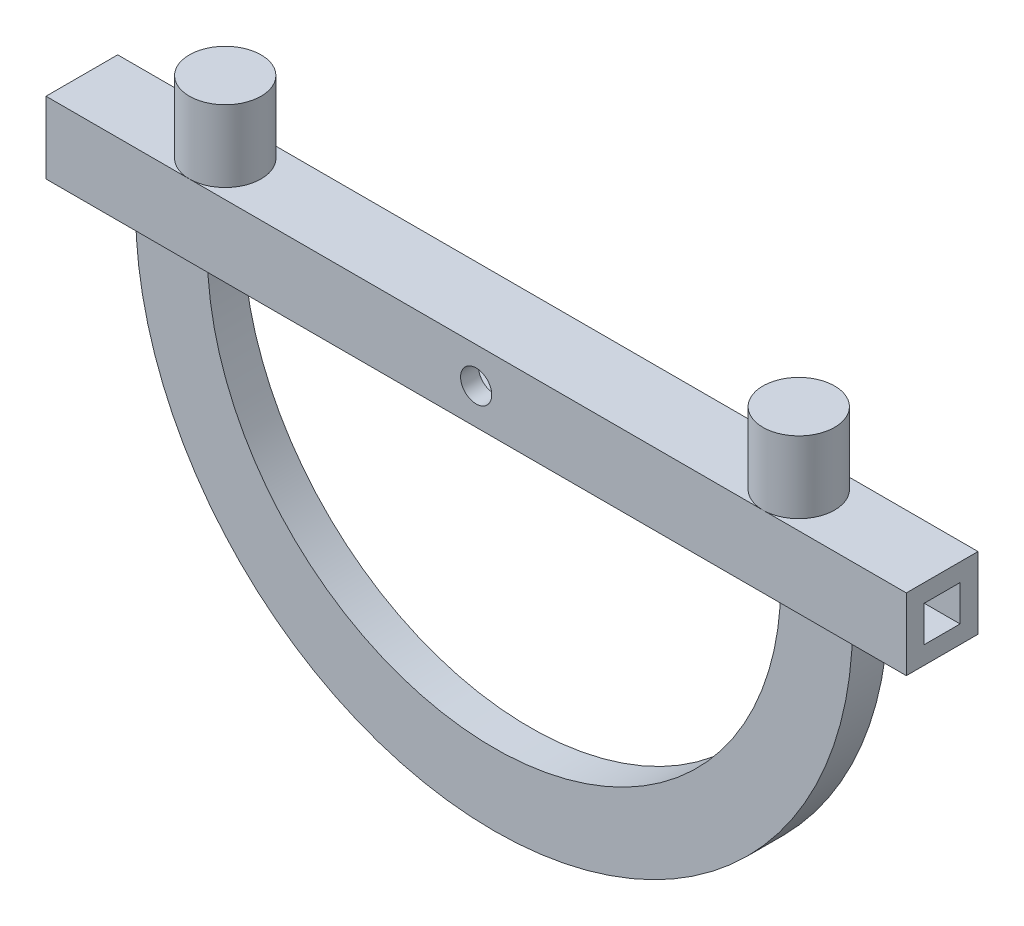
ISO-10303-21;
HEADER;
FILE_DESCRIPTION(('STEP AP214'),'2;1');
FILE_NAME('part.step','',(''),(''),'','','');
FILE_SCHEMA(('AUTOMOTIVE_DESIGN { 1 0 10303 214 1 1 1 1 }'));
ENDSEC;
DATA;
#1=APPLICATION_CONTEXT('core data for automotive mechanical design processes');
#2=APPLICATION_PROTOCOL_DEFINITION('international standard','automotive_design',2000,#1);
#3=PRODUCT_CONTEXT('',#1,'mechanical');
#4=PRODUCT('Part','Part','',(#3));
#5=PRODUCT_RELATED_PRODUCT_CATEGORY('part','',(#4));
#6=PRODUCT_DEFINITION_FORMATION('','',#4);
#7=PRODUCT_DEFINITION_CONTEXT('part definition',#1,'design');
#8=PRODUCT_DEFINITION('design','',#6,#7);
#9=PRODUCT_DEFINITION_SHAPE('','',#8);
#10=(LENGTH_UNIT() NAMED_UNIT(*) SI_UNIT(.MILLI.,.METRE.));
#11=(NAMED_UNIT(*) PLANE_ANGLE_UNIT() SI_UNIT($,.RADIAN.));
#12=(NAMED_UNIT(*) SI_UNIT($,.STERADIAN.) SOLID_ANGLE_UNIT());
#13=UNCERTAINTY_MEASURE_WITH_UNIT(LENGTH_MEASURE(1.E-05),#10,'distance_accuracy_value','');
#14=(GEOMETRIC_REPRESENTATION_CONTEXT(3) GLOBAL_UNCERTAINTY_ASSIGNED_CONTEXT((#13)) GLOBAL_UNIT_ASSIGNED_CONTEXT((#10,
#11,#12)) REPRESENTATION_CONTEXT('',''));
#15=CARTESIAN_POINT('',(0.,0.,0.));
#16=DIRECTION('',(0.,0.,1.));
#17=DIRECTION('',(1.,0.,0.));
#18=AXIS2_PLACEMENT_3D('',#15,#16,#17);
#19=CARTESIAN_POINT('',(-120.,20.0000000000004,10.));
#20=DIRECTION('',(0.,1.,0.));
#21=DIRECTION('',(0.,0.,1.));
#22=AXIS2_PLACEMENT_3D('',#19,#20,#21);
#23=PLANE('',#22);
#24=DIRECTION('',(1.,0.,0.));
#25=VECTOR('',#24,1.);
#26=CARTESIAN_POINT('',(-120.,20.0000000000004,10.));
#27=LINE('',#26,#25);
#28=CARTESIAN_POINT('',(-80.,20.0000000000004,9.99999999999999));
#29=VERTEX_POINT('',#28);
#30=CARTESIAN_POINT('',(80.,20.0000000000004,10.));
#31=VERTEX_POINT('',#30);
#32=EDGE_CURVE('E146',#29,#31,#27,.T.);
#33=ORIENTED_EDGE('',*,*,#32,.T.);
#34=CARTESIAN_POINT('',(80.,20.0000000000004,0.));
#35=DIRECTION('',(0.,1.,0.));
#36=DIRECTION('',(0.,0.,1.));
#37=AXIS2_PLACEMENT_3D('',#34,#35,#36);
#38=CIRCLE('',#37,9.99999999999999);
#39=CARTESIAN_POINT('',(80.,20.0000000000004,-10.));
#40=VERTEX_POINT('',#39);
#41=EDGE_CURVE('E50',#40,#31,#38,.T.);
#42=ORIENTED_EDGE('',*,*,#41,.F.);
#43=DIRECTION('',(1.,0.,0.));
#44=VECTOR('',#43,1.);
#45=CARTESIAN_POINT('',(-120.,20.0000000000004,-10.));
#46=LINE('',#45,#44);
#47=CARTESIAN_POINT('',(-80.,20.0000000000004,-10.));
#48=VERTEX_POINT('',#47);
#49=EDGE_CURVE('E143',#48,#40,#46,.T.);
#50=ORIENTED_EDGE('',*,*,#49,.F.);
#51=CARTESIAN_POINT('',(-80.,20.0000000000004,0.));
#52=DIRECTION('',(0.,1.,0.));
#53=DIRECTION('',(0.,0.,1.));
#54=AXIS2_PLACEMENT_3D('',#51,#52,#53);
#55=CIRCLE('',#54,9.99999999999999);
#56=EDGE_CURVE('E44',#29,#48,#55,.T.);
#57=ORIENTED_EDGE('',*,*,#56,.F.);
#58=EDGE_LOOP('',(#33,#42,#50,#57));
#59=FACE_BOUND('',#58,.T.);
#60=ADVANCED_FACE('F33',(#59),#23,.T.);
#61=CARTESIAN_POINT('',(120.,20.0000000000004,-10.));
#62=VERTEX_POINT('',#61);
#63=EDGE_CURVE('E148',#40,#62,#46,.T.);
#64=ORIENTED_EDGE('',*,*,#63,.F.);
#65=EDGE_CURVE('E132',#31,#40,#38,.T.);
#66=ORIENTED_EDGE('',*,*,#65,.F.);
#67=CARTESIAN_POINT('',(120.,20.0000000000004,10.));
#68=VERTEX_POINT('',#67);
#69=EDGE_CURVE('E161',#31,#68,#27,.T.);
#70=ORIENTED_EDGE('',*,*,#69,.T.);
#71=DIRECTION('',(0.,0.,1.));
#72=VECTOR('',#71,1.);
#73=CARTESIAN_POINT('',(120.,20.0000000000004,10.));
#74=LINE('',#73,#72);
#75=EDGE_CURVE('E151',#62,#68,#74,.T.);
#76=ORIENTED_EDGE('',*,*,#75,.F.);
#77=EDGE_LOOP('',(#64,#66,#70,#76));
#78=FACE_BOUND('',#77,.T.);
#79=ADVANCED_FACE('F149',(#78),#23,.T.);
#80=CARTESIAN_POINT('',(0.,0.,-5.));
#81=DIRECTION('',(0.,0.,1.));
#82=DIRECTION('',(1.,0.,0.));
#83=AXIS2_PLACEMENT_3D('',#80,#81,#82);
#84=CYLINDRICAL_SURFACE('',#83,100.);
#85=DIRECTION('',(0.,0.,1.));
#86=VECTOR('',#85,1.);
#87=CARTESIAN_POINT('',(100.,3.85887537858734E-13,-5.));
#88=LINE('',#87,#86);
#89=CARTESIAN_POINT('',(100.,3.85692806310763E-13,-5.));
#90=VERTEX_POINT('',#89);
#91=CARTESIAN_POINT('',(100.,0.,5.));
#92=VERTEX_POINT('',#91);
#93=EDGE_CURVE('E189',#90,#92,#88,.T.);
#94=ORIENTED_EDGE('',*,*,#93,.T.);
#95=CARTESIAN_POINT('',(0.,0.,5.));
#96=DIRECTION('',(0.,0.,1.));
#97=DIRECTION('',(1.,0.,0.));
#98=AXIS2_PLACEMENT_3D('',#95,#96,#97);
#99=CIRCLE('',#98,100.);
#100=CARTESIAN_POINT('',(-100.,2.48083823922827E-13,5.));
#101=VERTEX_POINT('',#100);
#102=EDGE_CURVE('E166',#101,#92,#99,.T.);
#103=ORIENTED_EDGE('',*,*,#102,.F.);
#104=DIRECTION('',(0.,0.,1.));
#105=VECTOR('',#104,1.);
#106=CARTESIAN_POINT('',(-100.,2.48083823922827E-13,-5.));
#107=LINE('',#106,#105);
#108=CARTESIAN_POINT('',(-100.,3.85692806310763E-13,-5.));
#109=VERTEX_POINT('',#108);
#110=EDGE_CURVE('E42',#109,#101,#107,.T.);
#111=ORIENTED_EDGE('',*,*,#110,.F.);
#112=CARTESIAN_POINT('',(0.,0.,-5.));
#113=DIRECTION('',(0.,0.,1.));
#114=DIRECTION('',(1.,0.,0.));
#115=AXIS2_PLACEMENT_3D('',#112,#113,#114);
#116=CIRCLE('',#115,100.);
#117=EDGE_CURVE('E179',#109,#90,#116,.T.);
#118=ORIENTED_EDGE('',*,*,#117,.T.);
#119=EDGE_LOOP('',(#94,#103,#111,#118));
#120=FACE_BOUND('',#119,.T.);
#121=ADVANCED_FACE('F35',(#120),#84,.T.);
#122=CARTESIAN_POINT('',(0.,0.,-5.));
#123=DIRECTION('',(0.,0.,1.));
#124=DIRECTION('',(1.,0.,0.));
#125=AXIS2_PLACEMENT_3D('',#122,#123,#124);
#126=CYLINDRICAL_SURFACE('',#125,80.);
#127=DIRECTION('',(0.,0.,1.));
#128=VECTOR('',#127,1.);
#129=CARTESIAN_POINT('',(-80.,1.98467059138262E-13,-5.));
#130=LINE('',#129,#128);
#131=CARTESIAN_POINT('',(-80.,3.85692806310763E-13,-5.));
#132=VERTEX_POINT('',#131);
#133=CARTESIAN_POINT('',(-80.,0.,5.));
#134=VERTEX_POINT('',#133);
#135=EDGE_CURVE('E191',#132,#134,#130,.T.);
#136=ORIENTED_EDGE('',*,*,#135,.T.);
#137=CARTESIAN_POINT('',(0.,0.,5.));
#138=DIRECTION('',(0.,0.,-1.));
#139=DIRECTION('',(1.,0.,0.));
#140=AXIS2_PLACEMENT_3D('',#137,#138,#139);
#141=CIRCLE('',#140,80.);
#142=CARTESIAN_POINT('',(80.,0.,5.));
#143=VERTEX_POINT('',#142);
#144=EDGE_CURVE('E173',#143,#134,#141,.T.);
#145=ORIENTED_EDGE('',*,*,#144,.F.);
#146=DIRECTION('',(0.,0.,1.));
#147=VECTOR('',#146,1.);
#148=CARTESIAN_POINT('',(80.,0.,-5.));
#149=LINE('',#148,#147);
#150=CARTESIAN_POINT('',(80.,3.85692806310763E-13,-5.));
#151=VERTEX_POINT('',#150);
#152=EDGE_CURVE('E194',#151,#143,#149,.T.);
#153=ORIENTED_EDGE('',*,*,#152,.F.);
#154=CARTESIAN_POINT('',(0.,0.,-5.));
#155=DIRECTION('',(0.,0.,-1.));
#156=DIRECTION('',(1.,0.,0.));
#157=AXIS2_PLACEMENT_3D('',#154,#155,#156);
#158=CIRCLE('',#157,80.);
#159=EDGE_CURVE('E184',#151,#132,#158,.T.);
#160=ORIENTED_EDGE('',*,*,#159,.T.);
#161=EDGE_LOOP('',(#136,#145,#153,#160));
#162=FACE_BOUND('',#161,.T.);
#163=ADVANCED_FACE('F208',(#162),#126,.F.);
#164=CARTESIAN_POINT('',(0.,0.,-5.));
#165=DIRECTION('',(0.,0.,1.));
#166=DIRECTION('',(1.,0.,0.));
#167=AXIS2_PLACEMENT_3D('',#164,#165,#166);
#168=PLANE('',#167);
#169=ORIENTED_EDGE('',*,*,#117,.F.);
#170=DIRECTION('',(-1.,0.,0.));
#171=VECTOR('',#170,1.);
#172=CARTESIAN_POINT('',(-100.,2.48083823922827E-13,-5.));
#173=LINE('',#172,#171);
#174=EDGE_CURVE('E187',#132,#109,#173,.T.);
#175=ORIENTED_EDGE('',*,*,#174,.F.);
#176=ORIENTED_EDGE('',*,*,#159,.F.);
#177=DIRECTION('',(-1.,0.,0.));
#178=VECTOR('',#177,1.);
#179=CARTESIAN_POINT('',(80.,3.08710030286987E-13,-5.));
#180=LINE('',#179,#178);
#181=EDGE_CURVE('E182',#90,#151,#180,.T.);
#182=ORIENTED_EDGE('',*,*,#181,.F.);
#183=EDGE_LOOP('',(#169,#175,#176,#182));
#184=FACE_BOUND('',#183,.T.);
#185=ADVANCED_FACE('F213',(#184),#168,.F.);
#186=CARTESIAN_POINT('',(0.,0.,5.));
#187=DIRECTION('',(0.,0.,1.));
#188=DIRECTION('',(1.,0.,0.));
#189=AXIS2_PLACEMENT_3D('',#186,#187,#188);
#190=PLANE('',#189);
#191=ORIENTED_EDGE('',*,*,#102,.T.);
#192=DIRECTION('',(-1.,0.,0.));
#193=VECTOR('',#192,1.);
#194=CARTESIAN_POINT('',(80.,3.08710030286987E-13,5.));
#195=LINE('',#194,#193);
#196=EDGE_CURVE('E169',#92,#143,#195,.T.);
#197=ORIENTED_EDGE('',*,*,#196,.T.);
#198=ORIENTED_EDGE('',*,*,#144,.T.);
#199=DIRECTION('',(-1.,0.,0.));
#200=VECTOR('',#199,1.);
#201=CARTESIAN_POINT('',(-100.,2.48083823922827E-13,5.));
#202=LINE('',#201,#200);
#203=EDGE_CURVE('E176',#134,#101,#202,.T.);
#204=ORIENTED_EDGE('',*,*,#203,.T.);
#205=EDGE_LOOP('',(#191,#197,#198,#204));
#206=FACE_BOUND('',#205,.T.);
#207=ADVANCED_FACE('F203',(#206),#190,.T.);
#208=CARTESIAN_POINT('',(-120.,3.85108611666851E-13,10.));
#209=DIRECTION('',(0.,-1.,0.));
#210=DIRECTION('',(0.,0.,-1.));
#211=AXIS2_PLACEMENT_3D('',#208,#209,#210);
#212=PLANE('',#211);
#213=ORIENTED_EDGE('',*,*,#181,.T.);
#214=ORIENTED_EDGE('',*,*,#152,.T.);
#215=ORIENTED_EDGE('',*,*,#196,.F.);
#216=ORIENTED_EDGE('',*,*,#93,.F.);
#217=EDGE_LOOP('',(#213,#214,#215,#216));
#218=FACE_BOUND('',#217,.T.);
#219=DIRECTION('',(1.,0.,0.));
#220=VECTOR('',#219,1.);
#221=CARTESIAN_POINT('',(-120.,3.85887537858734E-13,-10.));
#222=LINE('',#221,#220);
#223=CARTESIAN_POINT('',(-120.,3.85887537858734E-13,-10.));
#224=VERTEX_POINT('',#223);
#225=CARTESIAN_POINT('',(120.,3.85887537858734E-13,-10.));
#226=VERTEX_POINT('',#225);
#227=EDGE_CURVE('E170',#224,#226,#222,.T.);
#228=ORIENTED_EDGE('',*,*,#227,.T.);
#229=DIRECTION('',(0.,0.,-1.));
#230=VECTOR('',#229,1.);
#231=CARTESIAN_POINT('',(120.,3.85108611666851E-13,10.));
#232=LINE('',#231,#230);
#233=CARTESIAN_POINT('',(120.,3.85108611666851E-13,10.));
#234=VERTEX_POINT('',#233);
#235=EDGE_CURVE('E220',#234,#226,#232,.T.);
#236=ORIENTED_EDGE('',*,*,#235,.F.);
#237=DIRECTION('',(1.,0.,0.));
#238=VECTOR('',#237,1.);
#239=CARTESIAN_POINT('',(-120.,3.85108611666851E-13,10.));
#240=LINE('',#239,#238);
#241=CARTESIAN_POINT('',(-120.,3.85108611666851E-13,10.));
#242=VERTEX_POINT('',#241);
#243=EDGE_CURVE('E223',#242,#234,#240,.T.);
#244=ORIENTED_EDGE('',*,*,#243,.F.);
#245=DIRECTION('',(0.,0.,-1.));
#246=VECTOR('',#245,1.);
#247=CARTESIAN_POINT('',(-120.,3.85108611666851E-13,10.));
#248=LINE('',#247,#246);
#249=EDGE_CURVE('E155',#242,#224,#248,.T.);
#250=ORIENTED_EDGE('',*,*,#249,.T.);
#251=EDGE_LOOP('',(#228,#236,#244,#250));
#252=FACE_BOUND('',#251,.T.);
#253=ORIENTED_EDGE('',*,*,#174,.T.);
#254=ORIENTED_EDGE('',*,*,#110,.T.);
#255=ORIENTED_EDGE('',*,*,#203,.F.);
#256=ORIENTED_EDGE('',*,*,#135,.F.);
#257=EDGE_LOOP('',(#253,#254,#255,#256));
#258=FACE_BOUND('',#257,.T.);
#259=ADVANCED_FACE('F206',(#218,#252,#258),#212,.T.);
#260=CARTESIAN_POINT('',(-120.,20.0000000000004,-10.));
#261=DIRECTION('',(0.,0.,-1.));
#262=DIRECTION('',(0.,1.,0.));
#263=AXIS2_PLACEMENT_3D('',#260,#261,#262);
#264=PLANE('',#263);
#265=CARTESIAN_POINT('',(0.,10.0000000000004,-10.));
#266=DIRECTION('',(0.,0.,-1.));
#267=DIRECTION('',(0.,1.,0.));
#268=AXIS2_PLACEMENT_3D('',#265,#266,#267);
#269=CIRCLE('',#268,4.3511177416387);
#270=CARTESIAN_POINT('',(0.,14.3511177416391,-10.));
#271=VERTEX_POINT('',#270);
#272=EDGE_CURVE('E404',#271,#271,#269,.T.);
#273=ORIENTED_EDGE('',*,*,#272,.F.);
#274=EDGE_LOOP('',(#273));
#275=FACE_BOUND('',#274,.T.);
#276=CARTESIAN_POINT('',(-120.,20.0000000000004,-10.));
#277=VERTEX_POINT('',#276);
#278=EDGE_CURVE('E157',#277,#48,#46,.T.);
#279=ORIENTED_EDGE('',*,*,#278,.T.);
#280=ORIENTED_EDGE('',*,*,#49,.T.);
#281=ORIENTED_EDGE('',*,*,#63,.T.);
#282=DIRECTION('',(0.,1.,0.));
#283=VECTOR('',#282,1.);
#284=CARTESIAN_POINT('',(120.,20.0000000000004,-10.));
#285=LINE('',#284,#283);
#286=EDGE_CURVE('E229',#226,#62,#285,.T.);
#287=ORIENTED_EDGE('',*,*,#286,.F.);
#288=ORIENTED_EDGE('',*,*,#227,.F.);
#289=DIRECTION('',(0.,1.,0.));
#290=VECTOR('',#289,1.);
#291=CARTESIAN_POINT('',(-120.,20.0000000000004,-10.));
#292=LINE('',#291,#290);
#293=EDGE_CURVE('E257',#224,#277,#292,.T.);
#294=ORIENTED_EDGE('',*,*,#293,.T.);
#295=EDGE_LOOP('',(#279,#280,#281,#287,#288,#294));
#296=FACE_BOUND('',#295,.T.);
#297=ADVANCED_FACE('F158',(#275,#296),#264,.T.);
#298=CARTESIAN_POINT('',(-120.,20.0000000000004,10.));
#299=DIRECTION('',(0.,0.,1.));
#300=DIRECTION('',(1.,0.,0.));
#301=AXIS2_PLACEMENT_3D('',#298,#299,#300);
#302=PLANE('',#301);
#303=CARTESIAN_POINT('',(0.,10.0000000000004,9.99999999999999));
#304=DIRECTION('',(0.,0.,1.));
#305=DIRECTION('',(1.,0.,0.));
#306=AXIS2_PLACEMENT_3D('',#303,#304,#305);
#307=CIRCLE('',#306,4.3511177416387);
#308=CARTESIAN_POINT('',(4.3511177416387,10.0000000000004,9.99999999999999));
#309=VERTEX_POINT('',#308);
#310=EDGE_CURVE('E413',#309,#309,#307,.T.);
#311=ORIENTED_EDGE('',*,*,#310,.F.);
#312=EDGE_LOOP('',(#311));
#313=FACE_BOUND('',#312,.T.);
#314=ORIENTED_EDGE('',*,*,#243,.T.);
#315=DIRECTION('',(0.,-1.,0.));
#316=VECTOR('',#315,1.);
#317=CARTESIAN_POINT('',(120.,20.0000000000004,10.));
#318=LINE('',#317,#316);
#319=EDGE_CURVE('E231',#68,#234,#318,.T.);
#320=ORIENTED_EDGE('',*,*,#319,.F.);
#321=ORIENTED_EDGE('',*,*,#69,.F.);
#322=ORIENTED_EDGE('',*,*,#32,.F.);
#323=CARTESIAN_POINT('',(-120.,20.0000000000004,10.));
#324=VERTEX_POINT('',#323);
#325=EDGE_CURVE('E164',#324,#29,#27,.T.);
#326=ORIENTED_EDGE('',*,*,#325,.F.);
#327=DIRECTION('',(0.,-1.,0.));
#328=VECTOR('',#327,1.);
#329=CARTESIAN_POINT('',(-120.,20.0000000000004,10.));
#330=LINE('',#329,#328);
#331=EDGE_CURVE('E267',#324,#242,#330,.T.);
#332=ORIENTED_EDGE('',*,*,#331,.T.);
#333=EDGE_LOOP('',(#314,#320,#321,#322,#326,#332));
#334=FACE_BOUND('',#333,.T.);
#335=ADVANCED_FACE('F271',(#313,#334),#302,.T.);
#336=EDGE_CURVE('E11',#48,#29,#55,.T.);
#337=ORIENTED_EDGE('',*,*,#336,.F.);
#338=ORIENTED_EDGE('',*,*,#278,.F.);
#339=DIRECTION('',(0.,0.,1.));
#340=VECTOR('',#339,1.);
#341=CARTESIAN_POINT('',(-120.,20.0000000000004,10.));
#342=LINE('',#341,#340);
#343=EDGE_CURVE('E264',#277,#324,#342,.T.);
#344=ORIENTED_EDGE('',*,*,#343,.T.);
#345=ORIENTED_EDGE('',*,*,#325,.T.);
#346=EDGE_LOOP('',(#337,#338,#344,#345));
#347=FACE_BOUND('',#346,.T.);
#348=ADVANCED_FACE('F273',(#347),#23,.T.);
#349=CARTESIAN_POINT('',(-120.,0.,0.));
#350=DIRECTION('',(1.,0.,0.));
#351=DIRECTION('',(0.,0.,-1.));
#352=AXIS2_PLACEMENT_3D('',#349,#350,#351);
#353=PLANE('',#352);
#354=DIRECTION('',(0.,0.,-1.));
#355=VECTOR('',#354,1.);
#356=CARTESIAN_POINT('',(-120.,5.00000000000039,4.99999999999999));
#357=LINE('',#356,#355);
#358=CARTESIAN_POINT('',(-120.,5.00000000000039,4.99999999999999));
#359=VERTEX_POINT('',#358);
#360=CARTESIAN_POINT('',(-120.,5.00000000000039,-5.00000000000001));
#361=VERTEX_POINT('',#360);
#362=EDGE_CURVE('E251',#359,#361,#357,.T.);
#363=ORIENTED_EDGE('',*,*,#362,.T.);
#364=DIRECTION('',(0.,1.,0.));
#365=VECTOR('',#364,1.);
#366=CARTESIAN_POINT('',(-120.,15.0000000000004,-5.));
#367=LINE('',#366,#365);
#368=CARTESIAN_POINT('',(-120.,15.0000000000004,-5.));
#369=VERTEX_POINT('',#368);
#370=EDGE_CURVE('E232',#361,#369,#367,.T.);
#371=ORIENTED_EDGE('',*,*,#370,.T.);
#372=DIRECTION('',(0.,0.,1.));
#373=VECTOR('',#372,1.);
#374=CARTESIAN_POINT('',(-120.,15.0000000000004,5.));
#375=LINE('',#374,#373);
#376=CARTESIAN_POINT('',(-120.,15.0000000000004,5.));
#377=VERTEX_POINT('',#376);
#378=EDGE_CURVE('E245',#369,#377,#375,.T.);
#379=ORIENTED_EDGE('',*,*,#378,.T.);
#380=DIRECTION('',(0.,-1.,0.));
#381=VECTOR('',#380,1.);
#382=CARTESIAN_POINT('',(-120.,15.0000000000004,5.));
#383=LINE('',#382,#381);
#384=EDGE_CURVE('E248',#377,#359,#383,.T.);
#385=ORIENTED_EDGE('',*,*,#384,.T.);
#386=EDGE_LOOP('',(#363,#371,#379,#385));
#387=FACE_BOUND('',#386,.T.);
#388=ORIENTED_EDGE('',*,*,#293,.F.);
#389=ORIENTED_EDGE('',*,*,#249,.F.);
#390=ORIENTED_EDGE('',*,*,#331,.F.);
#391=ORIENTED_EDGE('',*,*,#343,.F.);
#392=EDGE_LOOP('',(#388,#389,#390,#391));
#393=FACE_BOUND('',#392,.T.);
#394=ADVANCED_FACE('F280',(#387,#393),#353,.F.);
#395=CARTESIAN_POINT('',(-120.,15.0000000000004,-5.));
#396=DIRECTION('',(0.,0.,-1.));
#397=DIRECTION('',(0.,1.,0.));
#398=AXIS2_PLACEMENT_3D('',#395,#396,#397);
#399=PLANE('',#398);
#400=CARTESIAN_POINT('',(0.,10.0000000000004,-5.));
#401=DIRECTION('',(0.,0.,-1.));
#402=DIRECTION('',(0.,1.,0.));
#403=AXIS2_PLACEMENT_3D('',#400,#401,#402);
#404=CIRCLE('',#403,4.3511177416387);
#405=CARTESIAN_POINT('',(0.,14.3511177416391,-5.));
#406=VERTEX_POINT('',#405);
#407=EDGE_CURVE('E410',#406,#406,#404,.T.);
#408=ORIENTED_EDGE('',*,*,#407,.T.);
#409=EDGE_LOOP('',(#408));
#410=FACE_BOUND('',#409,.T.);
#411=DIRECTION('',(1.,0.,0.));
#412=VECTOR('',#411,1.);
#413=CARTESIAN_POINT('',(-120.,5.00000000000039,-5.00000000000001));
#414=LINE('',#413,#412);
#415=CARTESIAN_POINT('',(120.,5.00000000000039,-5.00000000000001));
#416=VERTEX_POINT('',#415);
#417=EDGE_CURVE('E255',#361,#416,#414,.T.);
#418=ORIENTED_EDGE('',*,*,#417,.T.);
#419=DIRECTION('',(0.,1.,0.));
#420=VECTOR('',#419,1.);
#421=CARTESIAN_POINT('',(120.,15.0000000000004,-5.));
#422=LINE('',#421,#420);
#423=CARTESIAN_POINT('',(120.,15.0000000000004,-5.));
#424=VERTEX_POINT('',#423);
#425=EDGE_CURVE('E416',#416,#424,#422,.T.);
#426=ORIENTED_EDGE('',*,*,#425,.T.);
#427=DIRECTION('',(1.,0.,0.));
#428=VECTOR('',#427,1.);
#429=CARTESIAN_POINT('',(-120.,15.0000000000004,-5.));
#430=LINE('',#429,#428);
#431=EDGE_CURVE('E254',#369,#424,#430,.T.);
#432=ORIENTED_EDGE('',*,*,#431,.F.);
#433=ORIENTED_EDGE('',*,*,#370,.F.);
#434=EDGE_LOOP('',(#418,#426,#432,#433));
#435=FACE_BOUND('',#434,.T.);
#436=ADVANCED_FACE('F383',(#410,#435),#399,.F.);
#437=CARTESIAN_POINT('',(-120.,5.00000000000039,4.99999999999999));
#438=DIRECTION('',(0.,-1.,0.));
#439=DIRECTION('',(0.,0.,-1.));
#440=AXIS2_PLACEMENT_3D('',#437,#438,#439);
#441=PLANE('',#440);
#442=DIRECTION('',(1.,0.,0.));
#443=VECTOR('',#442,1.);
#444=CARTESIAN_POINT('',(-120.,5.00000000000039,4.99999999999999));
#445=LINE('',#444,#443);
#446=CARTESIAN_POINT('',(120.,5.00000000000039,4.99999999999999));
#447=VERTEX_POINT('',#446);
#448=EDGE_CURVE('E258',#359,#447,#445,.T.);
#449=ORIENTED_EDGE('',*,*,#448,.T.);
#450=DIRECTION('',(0.,0.,-1.));
#451=VECTOR('',#450,1.);
#452=CARTESIAN_POINT('',(120.,5.00000000000039,4.99999999999999));
#453=LINE('',#452,#451);
#454=EDGE_CURVE('E234',#447,#416,#453,.T.);
#455=ORIENTED_EDGE('',*,*,#454,.T.);
#456=ORIENTED_EDGE('',*,*,#417,.F.);
#457=ORIENTED_EDGE('',*,*,#362,.F.);
#458=EDGE_LOOP('',(#449,#455,#456,#457));
#459=FACE_BOUND('',#458,.T.);
#460=ADVANCED_FACE('F379',(#459),#441,.F.);
#461=CARTESIAN_POINT('',(-120.,15.0000000000004,5.));
#462=DIRECTION('',(0.,0.,1.));
#463=DIRECTION('',(0.,-1.,0.));
#464=AXIS2_PLACEMENT_3D('',#461,#462,#463);
#465=PLANE('',#464);
#466=CARTESIAN_POINT('',(0.,10.0000000000004,4.99999999999999));
#467=DIRECTION('',(0.,0.,1.));
#468=DIRECTION('',(0.,-1.,0.));
#469=AXIS2_PLACEMENT_3D('',#466,#467,#468);
#470=CIRCLE('',#469,4.3511177416387);
#471=CARTESIAN_POINT('',(0.,5.64888225836168,4.99999999999999));
#472=VERTEX_POINT('',#471);
#473=EDGE_CURVE('E37',#472,#472,#470,.T.);
#474=ORIENTED_EDGE('',*,*,#473,.T.);
#475=EDGE_LOOP('',(#474));
#476=FACE_BOUND('',#475,.T.);
#477=DIRECTION('',(1.,0.,0.));
#478=VECTOR('',#477,1.);
#479=CARTESIAN_POINT('',(-120.,15.0000000000004,5.));
#480=LINE('',#479,#478);
#481=CARTESIAN_POINT('',(120.,15.0000000000004,5.));
#482=VERTEX_POINT('',#481);
#483=EDGE_CURVE('E260',#377,#482,#480,.T.);
#484=ORIENTED_EDGE('',*,*,#483,.T.);
#485=DIRECTION('',(0.,-1.,0.));
#486=VECTOR('',#485,1.);
#487=CARTESIAN_POINT('',(120.,15.0000000000004,5.));
#488=LINE('',#487,#486);
#489=EDGE_CURVE('E238',#482,#447,#488,.T.);
#490=ORIENTED_EDGE('',*,*,#489,.T.);
#491=ORIENTED_EDGE('',*,*,#448,.F.);
#492=ORIENTED_EDGE('',*,*,#384,.F.);
#493=EDGE_LOOP('',(#484,#490,#491,#492));
#494=FACE_BOUND('',#493,.T.);
#495=ADVANCED_FACE('F382',(#476,#494),#465,.F.);
#496=CARTESIAN_POINT('',(-120.,15.0000000000004,5.));
#497=DIRECTION('',(0.,1.,0.));
#498=DIRECTION('',(0.,0.,1.));
#499=AXIS2_PLACEMENT_3D('',#496,#497,#498);
#500=PLANE('',#499);
#501=ORIENTED_EDGE('',*,*,#431,.T.);
#502=DIRECTION('',(0.,0.,1.));
#503=VECTOR('',#502,1.);
#504=CARTESIAN_POINT('',(120.,15.0000000000004,5.));
#505=LINE('',#504,#503);
#506=EDGE_CURVE('E419',#424,#482,#505,.T.);
#507=ORIENTED_EDGE('',*,*,#506,.T.);
#508=ORIENTED_EDGE('',*,*,#483,.F.);
#509=ORIENTED_EDGE('',*,*,#378,.F.);
#510=EDGE_LOOP('',(#501,#507,#508,#509));
#511=FACE_BOUND('',#510,.T.);
#512=ADVANCED_FACE('F378',(#511),#500,.F.);
#513=CARTESIAN_POINT('',(120.,0.,0.));
#514=DIRECTION('',(1.,0.,0.));
#515=DIRECTION('',(0.,0.,-1.));
#516=AXIS2_PLACEMENT_3D('',#513,#514,#515);
#517=PLANE('',#516);
#518=ORIENTED_EDGE('',*,*,#286,.T.);
#519=ORIENTED_EDGE('',*,*,#75,.T.);
#520=ORIENTED_EDGE('',*,*,#319,.T.);
#521=ORIENTED_EDGE('',*,*,#235,.T.);
#522=EDGE_LOOP('',(#518,#519,#520,#521));
#523=FACE_BOUND('',#522,.T.);
#524=ORIENTED_EDGE('',*,*,#506,.F.);
#525=ORIENTED_EDGE('',*,*,#425,.F.);
#526=ORIENTED_EDGE('',*,*,#454,.F.);
#527=ORIENTED_EDGE('',*,*,#489,.F.);
#528=EDGE_LOOP('',(#524,#525,#526,#527));
#529=FACE_BOUND('',#528,.T.);
#530=ADVANCED_FACE('F227',(#523,#529),#517,.T.);
#531=CARTESIAN_POINT('',(0.,10.0000000000004,110.));
#532=DIRECTION('',(0.,0.,-1.));
#533=DIRECTION('',(0.,1.,0.));
#534=AXIS2_PLACEMENT_3D('',#531,#532,#533);
#535=CYLINDRICAL_SURFACE('',#534,4.3511177416387);
#536=ORIENTED_EDGE('',*,*,#310,.T.);
#537=EDGE_LOOP('',(#536));
#538=FACE_BOUND('',#537,.T.);
#539=ORIENTED_EDGE('',*,*,#473,.F.);
#540=EDGE_LOOP('',(#539));
#541=FACE_BOUND('',#540,.T.);
#542=ADVANCED_FACE('F374',(#538,#541),#535,.F.);
#543=ORIENTED_EDGE('',*,*,#272,.T.);
#544=EDGE_LOOP('',(#543));
#545=FACE_BOUND('',#544,.T.);
#546=ORIENTED_EDGE('',*,*,#407,.F.);
#547=EDGE_LOOP('',(#546));
#548=FACE_BOUND('',#547,.T.);
#549=ADVANCED_FACE('F337',(#545,#548),#535,.F.);
#550=CARTESIAN_POINT('',(-80.,40.0000000000004,0.));
#551=DIRECTION('',(0.,-1.,0.));
#552=DIRECTION('',(0.,0.,-1.));
#553=AXIS2_PLACEMENT_3D('',#550,#551,#552);
#554=CYLINDRICAL_SURFACE('',#553,9.99999999999999);
#555=CARTESIAN_POINT('',(-80.,40.0000000000004,0.));
#556=DIRECTION('',(0.,1.,0.));
#557=DIRECTION('',(0.,0.,1.));
#558=AXIS2_PLACEMENT_3D('',#555,#556,#557);
#559=CIRCLE('',#558,9.99999999999999);
#560=CARTESIAN_POINT('',(-80.,40.0000000000004,9.99999999999999));
#561=VERTEX_POINT('',#560);
#562=EDGE_CURVE('E402',#561,#561,#559,.T.);
#563=ORIENTED_EDGE('',*,*,#562,.F.);
#564=EDGE_LOOP('',(#563));
#565=FACE_BOUND('',#564,.T.);
#566=ORIENTED_EDGE('',*,*,#56,.T.);
#567=ORIENTED_EDGE('',*,*,#336,.T.);
#568=EDGE_LOOP('',(#566,#567));
#569=FACE_BOUND('',#568,.T.);
#570=ADVANCED_FACE('F331',(#565,#569),#554,.T.);
#571=CARTESIAN_POINT('',(-80.,40.0000000000004,0.));
#572=DIRECTION('',(0.,1.,0.));
#573=DIRECTION('',(0.,0.,1.));
#574=AXIS2_PLACEMENT_3D('',#571,#572,#573);
#575=PLANE('',#574);
#576=ORIENTED_EDGE('',*,*,#562,.T.);
#577=EDGE_LOOP('',(#576));
#578=FACE_BOUND('',#577,.T.);
#579=ADVANCED_FACE('F336',(#578),#575,.T.);
#580=CARTESIAN_POINT('',(80.,40.0000000000004,0.));
#581=DIRECTION('',(0.,-1.,0.));
#582=DIRECTION('',(0.,0.,-1.));
#583=AXIS2_PLACEMENT_3D('',#580,#581,#582);
#584=CYLINDRICAL_SURFACE('',#583,9.99999999999999);
#585=CARTESIAN_POINT('',(80.,40.0000000000004,0.));
#586=DIRECTION('',(0.,1.,0.));
#587=DIRECTION('',(0.,0.,1.));
#588=AXIS2_PLACEMENT_3D('',#585,#586,#587);
#589=CIRCLE('',#588,9.99999999999999);
#590=CARTESIAN_POINT('',(80.,40.0000000000004,9.99999999999999));
#591=VERTEX_POINT('',#590);
#592=EDGE_CURVE('E137',#591,#591,#589,.T.);
#593=ORIENTED_EDGE('',*,*,#592,.F.);
#594=EDGE_LOOP('',(#593));
#595=FACE_BOUND('',#594,.T.);
#596=ORIENTED_EDGE('',*,*,#65,.T.);
#597=ORIENTED_EDGE('',*,*,#41,.T.);
#598=EDGE_LOOP('',(#596,#597));
#599=FACE_BOUND('',#598,.T.);
#600=ADVANCED_FACE('F133',(#595,#599),#584,.T.);
#601=CARTESIAN_POINT('',(80.,40.0000000000004,0.));
#602=DIRECTION('',(0.,1.,0.));
#603=DIRECTION('',(0.,0.,1.));
#604=AXIS2_PLACEMENT_3D('',#601,#602,#603);
#605=PLANE('',#604);
#606=ORIENTED_EDGE('',*,*,#592,.T.);
#607=EDGE_LOOP('',(#606));
#608=FACE_BOUND('',#607,.T.);
#609=ADVANCED_FACE('F357',(#608),#605,.T.);
#610=CLOSED_SHELL('',(#60,#79,#121,#163,#185,#207,#259,#297,#335,#348,#394,#436,#460,#495,#512,
#530,#542,#549,#570,#579,#600,#609));
#611=MANIFOLD_SOLID_BREP('B2',#610);
#612=ADVANCED_BREP_SHAPE_REPRESENTATION('',(#18,#611),#14);
#613=SHAPE_DEFINITION_REPRESENTATION(#9,#612);
ENDSEC;
END-ISO-10303-21;
